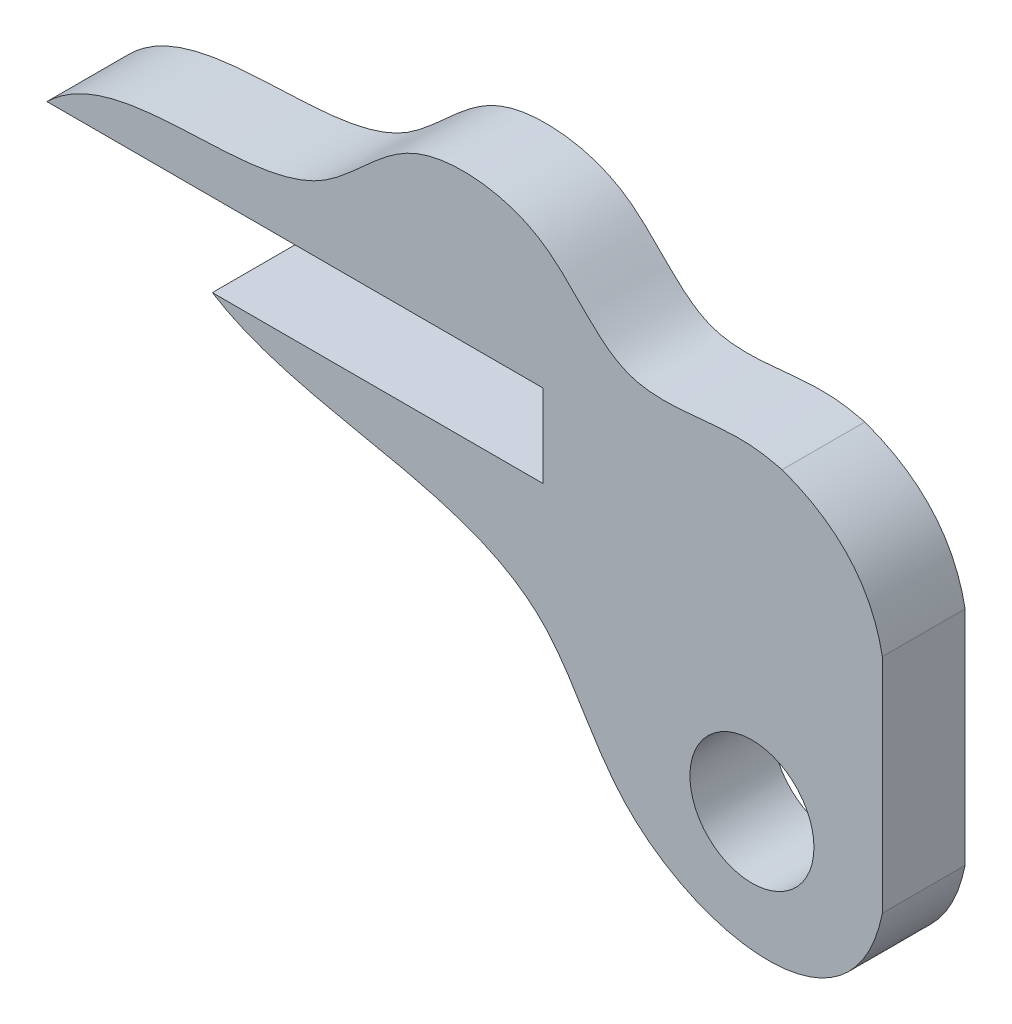
ISO-10303-21;
HEADER;
FILE_DESCRIPTION(('STEP AP214'),'2;1');
FILE_NAME('part.step','',(''),(''),'','','');
FILE_SCHEMA(('AUTOMOTIVE_DESIGN { 1 0 10303 214 1 1 1 1 }'));
ENDSEC;
DATA;
#1=APPLICATION_CONTEXT('core data for automotive mechanical design processes');
#2=APPLICATION_PROTOCOL_DEFINITION('international standard','automotive_design',2000,#1);
#3=PRODUCT_CONTEXT('',#1,'mechanical');
#4=PRODUCT('Part','Part','',(#3));
#5=PRODUCT_RELATED_PRODUCT_CATEGORY('part','',(#4));
#6=PRODUCT_DEFINITION_FORMATION('','',#4);
#7=PRODUCT_DEFINITION_CONTEXT('part definition',#1,'design');
#8=PRODUCT_DEFINITION('design','',#6,#7);
#9=PRODUCT_DEFINITION_SHAPE('','',#8);
#10=(LENGTH_UNIT() NAMED_UNIT(*) SI_UNIT(.MILLI.,.METRE.));
#11=(NAMED_UNIT(*) PLANE_ANGLE_UNIT() SI_UNIT($,.RADIAN.));
#12=(NAMED_UNIT(*) SI_UNIT($,.STERADIAN.) SOLID_ANGLE_UNIT());
#13=UNCERTAINTY_MEASURE_WITH_UNIT(LENGTH_MEASURE(1.E-05),#10,'distance_accuracy_value','');
#14=(GEOMETRIC_REPRESENTATION_CONTEXT(3) GLOBAL_UNCERTAINTY_ASSIGNED_CONTEXT((#13)) GLOBAL_UNIT_ASSIGNED_CONTEXT((#10,
#11,#12)) REPRESENTATION_CONTEXT('',''));
#15=CARTESIAN_POINT('',(0.,0.,0.));
#16=DIRECTION('',(0.,0.,1.));
#17=DIRECTION('',(1.,0.,0.));
#18=AXIS2_PLACEMENT_3D('',#15,#16,#17);
#19=CARTESIAN_POINT('',(8.05135951324775,32.9198127036697,3.175));
#20=DIRECTION('',(0.,0.,1.));
#21=DIRECTION('',(1.,0.,0.));
#22=AXIS2_PLACEMENT_3D('',#19,#20,#21);
#23=PLANE('',#22);
#24=CARTESIAN_POINT('',(20.2891433922223,29.1098947531925,3.175));
#25=CARTESIAN_POINT('',(23.5456222883819,27.9317030177142,3.175));
#26=CARTESIAN_POINT('',(24.1364840206898,24.8187753579518,3.175));
#27=B_SPLINE_CURVE_WITH_KNOTS('',2,(#24,#25,#26),.UNSPECIFIED.,.F.,.F.,(3,3),(0.,1.),.UNSPECIFIED.);
#28=CARTESIAN_POINT('',(20.2891433922223,29.1098947531925,3.175));
#29=VERTEX_POINT('',#28);
#30=CARTESIAN_POINT('',(24.1364840206898,24.8187753579518,3.175));
#31=VERTEX_POINT('',#30);
#32=EDGE_CURVE('E49',#29,#31,#27,.T.);
#33=ORIENTED_EDGE('',*,*,#32,.F.);
#34=CARTESIAN_POINT('',(24.1364840206898,28.4312745290859,3.175));
#35=CARTESIAN_POINT('',(22.3644153646628,28.2070195400865,3.175));
#36=CARTESIAN_POINT('',(19.4167461630137,30.0949571244458,3.175));
#37=CARTESIAN_POINT('',(14.1074264304524,28.2805259735645,3.175));
#38=CARTESIAN_POINT('',(11.7793272556716,32.0346299216371,3.175));
#39=CARTESIAN_POINT('',(8.77853622974078,33.0576477924047,3.175));
#40=CARTESIAN_POINT('',(5.39602748615531,32.7944900270653,3.175));
#41=CARTESIAN_POINT('',(1.48201779318253,27.321515058172,3.175));
#42=CARTESIAN_POINT('',(-5.13884849630011,29.9866044573812,3.175));
#43=CARTESIAN_POINT('',(-7.93749999999998,27.235546875,3.175));
#44=B_SPLINE_CURVE_WITH_KNOTS('',3,(#34,#35,#36,#37,#38,#39,#40,#41,#42,#43),.UNSPECIFIED.,.F.,
.F.,(4,1,1,1,1,1,1,4),(0.,0.147652968095478,0.287704516346607,0.407557175793848,
0.476513795953344,0.557846888152292,0.683290879230287,1.),.UNSPECIFIED.);
#45=CARTESIAN_POINT('',(-7.93749999999998,27.235546875,3.175));
#46=VERTEX_POINT('',#45);
#47=EDGE_CURVE('E89',#29,#46,#44,.T.);
#48=ORIENTED_EDGE('',*,*,#47,.T.);
#49=DIRECTION('',(1.,0.,0.));
#50=VECTOR('',#49,1.);
#51=CARTESIAN_POINT('',(-7.93749999999998,27.235546875,3.175));
#52=LINE('',#51,#50);
#53=CARTESIAN_POINT('',(11.1125,27.235546875,3.175));
#54=VERTEX_POINT('',#53);
#55=EDGE_CURVE('E103',#46,#54,#52,.T.);
#56=ORIENTED_EDGE('',*,*,#55,.T.);
#57=DIRECTION('',(0.,-1.,0.));
#58=VECTOR('',#57,1.);
#59=CARTESIAN_POINT('',(11.1125,27.235546875,3.175));
#60=LINE('',#59,#58);
#61=CARTESIAN_POINT('',(11.1125,24.060546875,3.175));
#62=VERTEX_POINT('',#61);
#63=EDGE_CURVE('E97',#54,#62,#60,.T.);
#64=ORIENTED_EDGE('',*,*,#63,.T.);
#65=DIRECTION('',(-1.,0.,0.));
#66=VECTOR('',#65,1.);
#67=CARTESIAN_POINT('',(11.1125,24.060546875,3.175));
#68=LINE('',#67,#66);
#69=CARTESIAN_POINT('',(-1.58749999999998,24.060546875,3.175));
#70=VERTEX_POINT('',#69);
#71=EDGE_CURVE('E101',#62,#70,#68,.T.);
#72=ORIENTED_EDGE('',*,*,#71,.T.);
#73=CARTESIAN_POINT('',(-1.58749999999998,24.060546875,3.175));
#74=CARTESIAN_POINT('',(2.01882562321256,21.7994195452908,3.175));
#75=CARTESIAN_POINT('',(10.6330027785918,22.7029130305284,3.175));
#76=CARTESIAN_POINT('',(14.4444493629529,12.3952881159599,3.175));
#77=CARTESIAN_POINT('',(23.0705376848001,11.0257505365206,3.175));
#78=CARTESIAN_POINT('',(24.1364840206898,16.2911838171291,3.175));
#79=B_SPLINE_CURVE_WITH_KNOTS('',3,(#73,#74,#75,#76,#77,#78),.UNSPECIFIED.,.F.,.F.,(4,1,1,4),
(0.,0.438351694540419,0.615086987956693,1.),.UNSPECIFIED.);
#80=CARTESIAN_POINT('',(24.1364840206898,16.2911838171291,3.175));
#81=VERTEX_POINT('',#80);
#82=EDGE_CURVE('E58',#70,#81,#79,.T.);
#83=ORIENTED_EDGE('',*,*,#82,.T.);
#84=DIRECTION('',(0.,1.,0.));
#85=VECTOR('',#84,1.);
#86=CARTESIAN_POINT('',(24.1364840206898,28.4312745290859,3.175));
#87=LINE('',#86,#85);
#88=EDGE_CURVE('E119',#81,#31,#87,.T.);
#89=ORIENTED_EDGE('',*,*,#88,.T.);
#90=EDGE_LOOP('',(#33,#48,#56,#64,#72,#83,#89));
#91=FACE_BOUND('',#90,.T.);
#92=CARTESIAN_POINT('',(19.1280767361943,17.1643973643512,3.175));
#93=DIRECTION('',(0.,0.,1.));
#94=DIRECTION('',(1.,0.,0.));
#95=AXIS2_PLACEMENT_3D('',#92,#93,#94);
#96=CIRCLE('',#95,2.38125);
#97=CARTESIAN_POINT('',(21.5093267361943,17.1643973643512,3.175));
#98=VERTEX_POINT('',#97);
#99=EDGE_CURVE('E184',#98,#98,#96,.T.);
#100=ORIENTED_EDGE('',*,*,#99,.F.);
#101=EDGE_LOOP('',(#100));
#102=FACE_BOUND('',#101,.T.);
#103=ADVANCED_FACE('F33',(#91,#102),#23,.T.);
#104=CARTESIAN_POINT('',(8.05135951324775,32.9198127036697,0.));
#105=DIRECTION('',(0.,0.,1.));
#106=DIRECTION('',(1.,0.,0.));
#107=AXIS2_PLACEMENT_3D('',#104,#105,#106);
#108=PLANE('',#107);
#109=CARTESIAN_POINT('',(24.1364840206898,28.4312745290859,0.));
#110=CARTESIAN_POINT('',(22.3644153646628,28.2070195400865,0.));
#111=CARTESIAN_POINT('',(19.4167461630137,30.0949571244458,0.));
#112=CARTESIAN_POINT('',(14.1074264304524,28.2805259735645,0.));
#113=CARTESIAN_POINT('',(11.7793272556716,32.0346299216371,0.));
#114=CARTESIAN_POINT('',(8.77853622974078,33.0576477924047,0.));
#115=CARTESIAN_POINT('',(5.39602748615531,32.7944900270653,0.));
#116=CARTESIAN_POINT('',(1.48201779318253,27.321515058172,0.));
#117=CARTESIAN_POINT('',(-5.13884849630011,29.9866044573812,0.));
#118=CARTESIAN_POINT('',(-7.93749999999998,27.235546875,0.));
#119=B_SPLINE_CURVE_WITH_KNOTS('',3,(#109,#110,#111,#112,#113,#114,#115,#116,#117,#118),
.UNSPECIFIED.,.F.,.F.,(4,1,1,1,1,1,1,4),(0.,0.147652968095478,0.287704516346607,
0.407557175793848,0.476513795953344,0.557846888152292,0.683290879230287,1.),.UNSPECIFIED.);
#120=CARTESIAN_POINT('',(20.2891433922223,29.1098947531925,0.));
#121=VERTEX_POINT('',#120);
#122=CARTESIAN_POINT('',(-7.93749999999998,27.235546875,0.));
#123=VERTEX_POINT('',#122);
#124=EDGE_CURVE('E187',#121,#123,#119,.T.);
#125=ORIENTED_EDGE('',*,*,#124,.F.);
#126=CARTESIAN_POINT('',(20.2891433922223,29.1098947531925,0.));
#127=CARTESIAN_POINT('',(23.5456222883819,27.9317030177142,0.));
#128=CARTESIAN_POINT('',(24.1364840206898,24.8187753579518,0.));
#129=B_SPLINE_CURVE_WITH_KNOTS('',2,(#126,#127,#128),.UNSPECIFIED.,.F.,.F.,(3,3),(0.,1.),.UNSPECIFIED.);
#130=CARTESIAN_POINT('',(24.1364840206898,24.8187753579518,0.));
#131=VERTEX_POINT('',#130);
#132=EDGE_CURVE('E164',#121,#131,#129,.T.);
#133=ORIENTED_EDGE('',*,*,#132,.T.);
#134=DIRECTION('',(0.,1.,0.));
#135=VECTOR('',#134,1.);
#136=CARTESIAN_POINT('',(24.1364840206898,28.4312745290859,0.));
#137=LINE('',#136,#135);
#138=CARTESIAN_POINT('',(24.1364840206898,16.2911838171291,0.));
#139=VERTEX_POINT('',#138);
#140=EDGE_CURVE('E192',#139,#131,#137,.T.);
#141=ORIENTED_EDGE('',*,*,#140,.F.);
#142=CARTESIAN_POINT('',(-1.58749999999998,24.060546875,0.));
#143=CARTESIAN_POINT('',(2.01882562321256,21.7994195452908,0.));
#144=CARTESIAN_POINT('',(10.6330027785918,22.7029130305284,0.));
#145=CARTESIAN_POINT('',(14.4444493629529,12.3952881159599,0.));
#146=CARTESIAN_POINT('',(23.0705376848001,11.0257505365206,0.));
#147=CARTESIAN_POINT('',(24.1364840206898,16.2911838171291,0.));
#148=B_SPLINE_CURVE_WITH_KNOTS('',3,(#142,#143,#144,#145,#146,#147),.UNSPECIFIED.,.F.,.F.,(4,1,
1,4),(0.,0.438351694540419,0.615086987956693,1.),.UNSPECIFIED.);
#149=CARTESIAN_POINT('',(-1.58749999999998,24.060546875,0.));
#150=VERTEX_POINT('',#149);
#151=EDGE_CURVE('E82',#150,#139,#148,.T.);
#152=ORIENTED_EDGE('',*,*,#151,.F.);
#153=DIRECTION('',(-1.,0.,0.));
#154=VECTOR('',#153,1.);
#155=CARTESIAN_POINT('',(11.1125,24.060546875,0.));
#156=LINE('',#155,#154);
#157=CARTESIAN_POINT('',(11.1125,24.060546875,0.));
#158=VERTEX_POINT('',#157);
#159=EDGE_CURVE('E201',#158,#150,#156,.T.);
#160=ORIENTED_EDGE('',*,*,#159,.F.);
#161=DIRECTION('',(0.,-1.,0.));
#162=VECTOR('',#161,1.);
#163=CARTESIAN_POINT('',(11.1125,27.235546875,0.));
#164=LINE('',#163,#162);
#165=CARTESIAN_POINT('',(11.1125,27.235546875,0.));
#166=VERTEX_POINT('',#165);
#167=EDGE_CURVE('E112',#166,#158,#164,.T.);
#168=ORIENTED_EDGE('',*,*,#167,.F.);
#169=DIRECTION('',(1.,0.,0.));
#170=VECTOR('',#169,1.);
#171=CARTESIAN_POINT('',(-7.93749999999998,27.235546875,0.));
#172=LINE('',#171,#170);
#173=EDGE_CURVE('E212',#123,#166,#172,.T.);
#174=ORIENTED_EDGE('',*,*,#173,.F.);
#175=EDGE_LOOP('',(#125,#133,#141,#152,#160,#168,#174));
#176=FACE_BOUND('',#175,.T.);
#177=CARTESIAN_POINT('',(19.1280767361943,17.1643973643512,0.));
#178=DIRECTION('',(0.,0.,1.));
#179=DIRECTION('',(1.,0.,0.));
#180=AXIS2_PLACEMENT_3D('',#177,#178,#179);
#181=CIRCLE('',#180,2.38125);
#182=CARTESIAN_POINT('',(21.5093267361943,17.1643973643512,0.));
#183=VERTEX_POINT('',#182);
#184=EDGE_CURVE('E182',#183,#183,#181,.T.);
#185=ORIENTED_EDGE('',*,*,#184,.T.);
#186=EDGE_LOOP('',(#185));
#187=FACE_BOUND('',#186,.T.);
#188=ADVANCED_FACE('F147',(#176,#187),#108,.F.);
#189=DIRECTION('',(0.,0.,-1.));
#190=VECTOR('',#189,1.);
#191=SURFACE_OF_LINEAR_EXTRUSION('',#44,#190);
#192=ORIENTED_EDGE('',*,*,#47,.F.);
#193=DIRECTION('',(0.,0.,1.));
#194=VECTOR('',#193,1.);
#195=CARTESIAN_POINT('',(20.2891433922223,29.1098947531925,0.));
#196=LINE('',#195,#194);
#197=EDGE_CURVE('E177',#121,#29,#196,.T.);
#198=ORIENTED_EDGE('',*,*,#197,.F.);
#199=ORIENTED_EDGE('',*,*,#124,.T.);
#200=DIRECTION('',(0.,0.,-1.));
#201=VECTOR('',#200,1.);
#202=CARTESIAN_POINT('',(-7.93749999999998,27.235546875,3.175));
#203=LINE('',#202,#201);
#204=EDGE_CURVE('E11',#46,#123,#203,.T.);
#205=ORIENTED_EDGE('',*,*,#204,.F.);
#206=EDGE_LOOP('',(#192,#198,#199,#205));
#207=FACE_BOUND('',#206,.T.);
#208=ADVANCED_FACE('F35',(#207),#191,.F.);
#209=CARTESIAN_POINT('',(-7.93749999999998,27.235546875,3.175));
#210=DIRECTION('',(0.,1.,0.));
#211=DIRECTION('',(0.,0.,1.));
#212=AXIS2_PLACEMENT_3D('',#209,#210,#211);
#213=PLANE('',#212);
#214=ORIENTED_EDGE('',*,*,#173,.T.);
#215=DIRECTION('',(0.,0.,-1.));
#216=VECTOR('',#215,1.);
#217=CARTESIAN_POINT('',(11.1125,27.235546875,3.175));
#218=LINE('',#217,#216);
#219=EDGE_CURVE('E42',#54,#166,#218,.T.);
#220=ORIENTED_EDGE('',*,*,#219,.F.);
#221=ORIENTED_EDGE('',*,*,#55,.F.);
#222=ORIENTED_EDGE('',*,*,#204,.T.);
#223=EDGE_LOOP('',(#214,#220,#221,#222));
#224=FACE_BOUND('',#223,.T.);
#225=ADVANCED_FACE('F140',(#224),#213,.F.);
#226=CARTESIAN_POINT('',(11.1125,27.235546875,3.175));
#227=DIRECTION('',(1.,0.,0.));
#228=DIRECTION('',(0.,0.,-1.));
#229=AXIS2_PLACEMENT_3D('',#226,#227,#228);
#230=PLANE('',#229);
#231=ORIENTED_EDGE('',*,*,#167,.T.);
#232=DIRECTION('',(0.,0.,-1.));
#233=VECTOR('',#232,1.);
#234=CARTESIAN_POINT('',(11.1125,24.060546875,3.175));
#235=LINE('',#234,#233);
#236=EDGE_CURVE('E109',#62,#158,#235,.T.);
#237=ORIENTED_EDGE('',*,*,#236,.F.);
#238=ORIENTED_EDGE('',*,*,#63,.F.);
#239=ORIENTED_EDGE('',*,*,#219,.T.);
#240=EDGE_LOOP('',(#231,#237,#238,#239));
#241=FACE_BOUND('',#240,.T.);
#242=ADVANCED_FACE('F110',(#241),#230,.F.);
#243=CARTESIAN_POINT('',(11.1125,24.060546875,3.175));
#244=DIRECTION('',(0.,-1.,0.));
#245=DIRECTION('',(0.,0.,-1.));
#246=AXIS2_PLACEMENT_3D('',#243,#244,#245);
#247=PLANE('',#246);
#248=ORIENTED_EDGE('',*,*,#159,.T.);
#249=DIRECTION('',(0.,0.,-1.));
#250=VECTOR('',#249,1.);
#251=CARTESIAN_POINT('',(-1.58749999999998,24.060546875,3.175));
#252=LINE('',#251,#250);
#253=EDGE_CURVE('E115',#70,#150,#252,.T.);
#254=ORIENTED_EDGE('',*,*,#253,.F.);
#255=ORIENTED_EDGE('',*,*,#71,.F.);
#256=ORIENTED_EDGE('',*,*,#236,.T.);
#257=EDGE_LOOP('',(#248,#254,#255,#256));
#258=FACE_BOUND('',#257,.T.);
#259=ADVANCED_FACE('F117',(#258),#247,.F.);
#260=DIRECTION('',(0.,0.,-1.));
#261=VECTOR('',#260,1.);
#262=SURFACE_OF_LINEAR_EXTRUSION('',#79,#261);
#263=ORIENTED_EDGE('',*,*,#151,.T.);
#264=DIRECTION('',(0.,0.,-1.));
#265=VECTOR('',#264,1.);
#266=CARTESIAN_POINT('',(24.1364840206898,16.2911838171291,3.175));
#267=LINE('',#266,#265);
#268=EDGE_CURVE('E207',#81,#139,#267,.T.);
#269=ORIENTED_EDGE('',*,*,#268,.F.);
#270=ORIENTED_EDGE('',*,*,#82,.F.);
#271=ORIENTED_EDGE('',*,*,#253,.T.);
#272=EDGE_LOOP('',(#263,#269,#270,#271));
#273=FACE_BOUND('',#272,.T.);
#274=ADVANCED_FACE('F131',(#273),#262,.F.);
#275=CARTESIAN_POINT('',(24.1364840206898,28.4312745290859,3.175));
#276=DIRECTION('',(-1.,0.,0.));
#277=DIRECTION('',(0.,0.,1.));
#278=AXIS2_PLACEMENT_3D('',#275,#276,#277);
#279=PLANE('',#278);
#280=ORIENTED_EDGE('',*,*,#140,.T.);
#281=DIRECTION('',(0.,0.,1.));
#282=VECTOR('',#281,1.);
#283=CARTESIAN_POINT('',(24.1364840206898,24.8187753579518,0.));
#284=LINE('',#283,#282);
#285=EDGE_CURVE('E170',#131,#31,#284,.T.);
#286=ORIENTED_EDGE('',*,*,#285,.T.);
#287=ORIENTED_EDGE('',*,*,#88,.F.);
#288=ORIENTED_EDGE('',*,*,#268,.T.);
#289=EDGE_LOOP('',(#280,#286,#287,#288));
#290=FACE_BOUND('',#289,.T.);
#291=ADVANCED_FACE('F135',(#290),#279,.F.);
#292=CARTESIAN_POINT('',(19.1280767361943,17.1643973643512,3.175));
#293=DIRECTION('',(0.,0.,-1.));
#294=DIRECTION('',(-1.,0.,0.));
#295=AXIS2_PLACEMENT_3D('',#292,#293,#294);
#296=CYLINDRICAL_SURFACE('',#295,2.38125);
#297=ORIENTED_EDGE('',*,*,#99,.T.);
#298=EDGE_LOOP('',(#297));
#299=FACE_BOUND('',#298,.T.);
#300=ORIENTED_EDGE('',*,*,#184,.F.);
#301=EDGE_LOOP('',(#300));
#302=FACE_BOUND('',#301,.T.);
#303=ADVANCED_FACE('F157',(#299,#302),#296,.F.);
#304=DIRECTION('',(0.,0.,1.));
#305=VECTOR('',#304,1.);
#306=SURFACE_OF_LINEAR_EXTRUSION('',#129,#305);
#307=ORIENTED_EDGE('',*,*,#32,.T.);
#308=ORIENTED_EDGE('',*,*,#285,.F.);
#309=ORIENTED_EDGE('',*,*,#132,.F.);
#310=ORIENTED_EDGE('',*,*,#197,.T.);
#311=EDGE_LOOP('',(#307,#308,#309,#310));
#312=FACE_BOUND('',#311,.T.);
#313=ADVANCED_FACE('F160',(#312),#306,.F.);
#314=CLOSED_SHELL('',(#103,#188,#208,#225,#242,#259,#274,#291,#303,#313));
#315=MANIFOLD_SOLID_BREP('B2',#314);
#316=ADVANCED_BREP_SHAPE_REPRESENTATION('',(#18,#315),#14);
#317=SHAPE_DEFINITION_REPRESENTATION(#9,#316);
ENDSEC;
END-ISO-10303-21;
